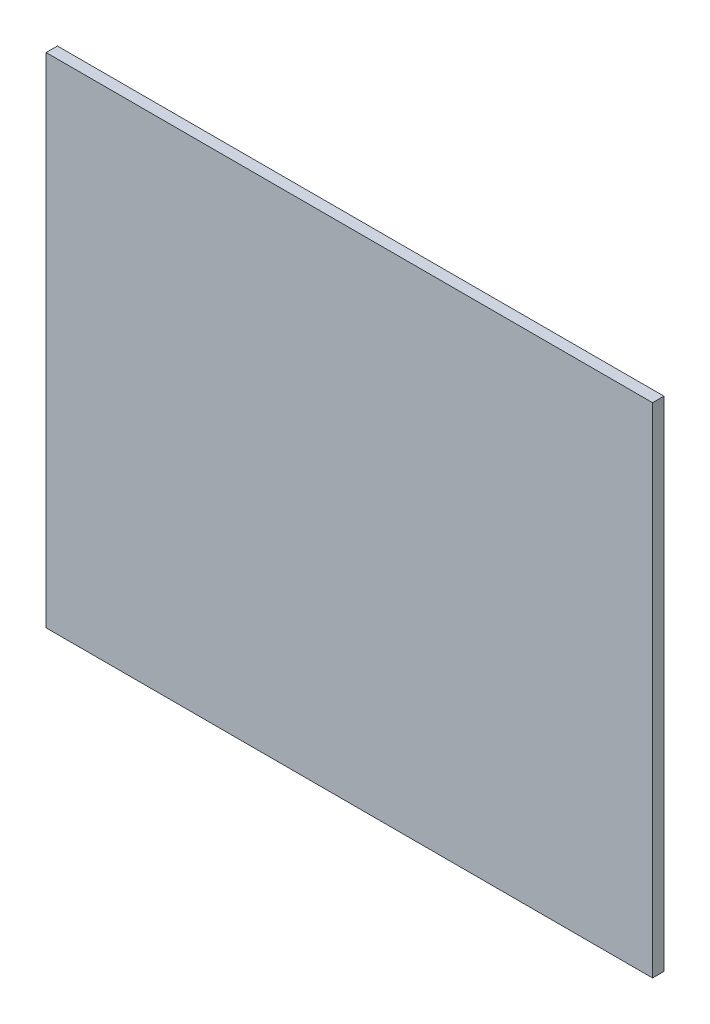
ISO-10303-21;
HEADER;
FILE_DESCRIPTION(('STEP AP214'),'2;1');
FILE_NAME('part.step','',(''),(''),'','','');
FILE_SCHEMA(('AUTOMOTIVE_DESIGN { 1 0 10303 214 1 1 1 1 }'));
ENDSEC;
DATA;
#1=APPLICATION_CONTEXT('core data for automotive mechanical design processes');
#2=APPLICATION_PROTOCOL_DEFINITION('international standard','automotive_design',2000,#1);
#3=PRODUCT_CONTEXT('',#1,'mechanical');
#4=PRODUCT('Part','Part','',(#3));
#5=PRODUCT_RELATED_PRODUCT_CATEGORY('part','',(#4));
#6=PRODUCT_DEFINITION_FORMATION('','',#4);
#7=PRODUCT_DEFINITION_CONTEXT('part definition',#1,'design');
#8=PRODUCT_DEFINITION('design','',#6,#7);
#9=PRODUCT_DEFINITION_SHAPE('','',#8);
#10=(LENGTH_UNIT() NAMED_UNIT(*) SI_UNIT(.MILLI.,.METRE.));
#11=(NAMED_UNIT(*) PLANE_ANGLE_UNIT() SI_UNIT($,.RADIAN.));
#12=(NAMED_UNIT(*) SI_UNIT($,.STERADIAN.) SOLID_ANGLE_UNIT());
#13=UNCERTAINTY_MEASURE_WITH_UNIT(LENGTH_MEASURE(1.E-05),#10,'distance_accuracy_value','');
#14=(GEOMETRIC_REPRESENTATION_CONTEXT(3) GLOBAL_UNCERTAINTY_ASSIGNED_CONTEXT((#13)) GLOBAL_UNIT_ASSIGNED_CONTEXT((#10,
#11,#12)) REPRESENTATION_CONTEXT('',''));
#15=CARTESIAN_POINT('',(0.,0.,0.));
#16=DIRECTION('',(0.,0.,1.));
#17=DIRECTION('',(1.,0.,0.));
#18=AXIS2_PLACEMENT_3D('',#15,#16,#17);
#19=CARTESIAN_POINT('',(0.,0.,18.));
#20=DIRECTION('',(1.,0.,0.));
#21=DIRECTION('',(0.,0.,-1.));
#22=AXIS2_PLACEMENT_3D('',#19,#20,#21);
#23=PLANE('',#22);
#24=DIRECTION('',(0.,-1.,0.));
#25=VECTOR('',#24,1.);
#26=CARTESIAN_POINT('',(0.,0.,0.));
#27=LINE('',#26,#25);
#28=CARTESIAN_POINT('',(0.,792.,0.));
#29=VERTEX_POINT('',#28);
#30=CARTESIAN_POINT('',(0.,0.,0.));
#31=VERTEX_POINT('',#30);
#32=EDGE_CURVE('E97',#29,#31,#27,.T.);
#33=ORIENTED_EDGE('',*,*,#32,.T.);
#34=DIRECTION('',(0.,0.,-1.));
#35=VECTOR('',#34,1.);
#36=CARTESIAN_POINT('',(0.,0.,18.));
#37=LINE('',#36,#35);
#38=CARTESIAN_POINT('',(0.,0.,18.));
#39=VERTEX_POINT('',#38);
#40=EDGE_CURVE('E11',#39,#31,#37,.T.);
#41=ORIENTED_EDGE('',*,*,#40,.F.);
#42=DIRECTION('',(0.,-1.,0.));
#43=VECTOR('',#42,1.);
#44=CARTESIAN_POINT('',(0.,0.,18.));
#45=LINE('',#44,#43);
#46=CARTESIAN_POINT('',(0.,792.,18.));
#47=VERTEX_POINT('',#46);
#48=EDGE_CURVE('E85',#47,#39,#45,.T.);
#49=ORIENTED_EDGE('',*,*,#48,.F.);
#50=DIRECTION('',(0.,0.,-1.));
#51=VECTOR('',#50,1.);
#52=CARTESIAN_POINT('',(0.,792.,18.));
#53=LINE('',#52,#51);
#54=EDGE_CURVE('E93',#47,#29,#53,.T.);
#55=ORIENTED_EDGE('',*,*,#54,.T.);
#56=EDGE_LOOP('',(#33,#41,#49,#55));
#57=FACE_BOUND('',#56,.T.);
#58=ADVANCED_FACE('F34',(#57),#23,.F.);
#59=CARTESIAN_POINT('',(0.,0.,18.));
#60=DIRECTION('',(0.,1.,0.));
#61=DIRECTION('',(0.,0.,1.));
#62=AXIS2_PLACEMENT_3D('',#59,#60,#61);
#63=PLANE('',#62);
#64=DIRECTION('',(1.,0.,0.));
#65=VECTOR('',#64,1.);
#66=CARTESIAN_POINT('',(0.,0.,0.));
#67=LINE('',#66,#65);
#68=CARTESIAN_POINT('',(964.,0.,0.));
#69=VERTEX_POINT('',#68);
#70=EDGE_CURVE('E89',#31,#69,#67,.T.);
#71=ORIENTED_EDGE('',*,*,#70,.T.);
#72=DIRECTION('',(0.,0.,-1.));
#73=VECTOR('',#72,1.);
#74=CARTESIAN_POINT('',(964.,0.,18.));
#75=LINE('',#74,#73);
#76=CARTESIAN_POINT('',(964.,0.,18.));
#77=VERTEX_POINT('',#76);
#78=EDGE_CURVE('E42',#77,#69,#75,.T.);
#79=ORIENTED_EDGE('',*,*,#78,.F.);
#80=DIRECTION('',(1.,0.,0.));
#81=VECTOR('',#80,1.);
#82=CARTESIAN_POINT('',(0.,0.,18.));
#83=LINE('',#82,#81);
#84=EDGE_CURVE('E80',#39,#77,#83,.T.);
#85=ORIENTED_EDGE('',*,*,#84,.F.);
#86=ORIENTED_EDGE('',*,*,#40,.T.);
#87=EDGE_LOOP('',(#71,#79,#85,#86));
#88=FACE_BOUND('',#87,.T.);
#89=ADVANCED_FACE('F88',(#88),#63,.F.);
#90=CARTESIAN_POINT('',(964.,0.,18.));
#91=DIRECTION('',(-1.,0.,0.));
#92=DIRECTION('',(0.,-1.,0.));
#93=AXIS2_PLACEMENT_3D('',#90,#91,#92);
#94=PLANE('',#93);
#95=DIRECTION('',(0.,1.,0.));
#96=VECTOR('',#95,1.);
#97=CARTESIAN_POINT('',(964.,0.,0.));
#98=LINE('',#97,#96);
#99=CARTESIAN_POINT('',(964.,792.,0.));
#100=VERTEX_POINT('',#99);
#101=EDGE_CURVE('E67',#69,#100,#98,.T.);
#102=ORIENTED_EDGE('',*,*,#101,.T.);
#103=DIRECTION('',(0.,0.,-1.));
#104=VECTOR('',#103,1.);
#105=CARTESIAN_POINT('',(964.,792.,18.));
#106=LINE('',#105,#104);
#107=CARTESIAN_POINT('',(964.,792.,18.));
#108=VERTEX_POINT('',#107);
#109=EDGE_CURVE('E90',#108,#100,#106,.T.);
#110=ORIENTED_EDGE('',*,*,#109,.F.);
#111=DIRECTION('',(0.,1.,0.));
#112=VECTOR('',#111,1.);
#113=CARTESIAN_POINT('',(964.,0.,18.));
#114=LINE('',#113,#112);
#115=EDGE_CURVE('E83',#77,#108,#114,.T.);
#116=ORIENTED_EDGE('',*,*,#115,.F.);
#117=ORIENTED_EDGE('',*,*,#78,.T.);
#118=EDGE_LOOP('',(#102,#110,#116,#117));
#119=FACE_BOUND('',#118,.T.);
#120=ADVANCED_FACE('F91',(#119),#94,.F.);
#121=CARTESIAN_POINT('',(0.,792.,18.));
#122=DIRECTION('',(0.,-1.,0.));
#123=DIRECTION('',(0.,0.,-1.));
#124=AXIS2_PLACEMENT_3D('',#121,#122,#123);
#125=PLANE('',#124);
#126=DIRECTION('',(-1.,0.,0.));
#127=VECTOR('',#126,1.);
#128=CARTESIAN_POINT('',(0.,792.,0.));
#129=LINE('',#128,#127);
#130=EDGE_CURVE('E73',#100,#29,#129,.T.);
#131=ORIENTED_EDGE('',*,*,#130,.T.);
#132=ORIENTED_EDGE('',*,*,#54,.F.);
#133=DIRECTION('',(-1.,0.,0.));
#134=VECTOR('',#133,1.);
#135=CARTESIAN_POINT('',(0.,792.,18.));
#136=LINE('',#135,#134);
#137=EDGE_CURVE('E50',#108,#47,#136,.T.);
#138=ORIENTED_EDGE('',*,*,#137,.F.);
#139=ORIENTED_EDGE('',*,*,#109,.T.);
#140=EDGE_LOOP('',(#131,#132,#138,#139));
#141=FACE_BOUND('',#140,.T.);
#142=ADVANCED_FACE('F104',(#141),#125,.F.);
#143=CARTESIAN_POINT('',(0.,0.,18.));
#144=DIRECTION('',(0.,0.,-1.));
#145=DIRECTION('',(-1.,0.,0.));
#146=AXIS2_PLACEMENT_3D('',#143,#144,#145);
#147=PLANE('',#146);
#148=ORIENTED_EDGE('',*,*,#48,.T.);
#149=ORIENTED_EDGE('',*,*,#84,.T.);
#150=ORIENTED_EDGE('',*,*,#115,.T.);
#151=ORIENTED_EDGE('',*,*,#137,.T.);
#152=EDGE_LOOP('',(#148,#149,#150,#151));
#153=FACE_BOUND('',#152,.T.);
#154=ADVANCED_FACE('F81',(#153),#147,.F.);
#155=CARTESIAN_POINT('',(0.,0.,0.));
#156=DIRECTION('',(0.,0.,-1.));
#157=DIRECTION('',(-1.,0.,0.));
#158=AXIS2_PLACEMENT_3D('',#155,#156,#157);
#159=PLANE('',#158);
#160=ORIENTED_EDGE('',*,*,#32,.F.);
#161=ORIENTED_EDGE('',*,*,#130,.F.);
#162=ORIENTED_EDGE('',*,*,#101,.F.);
#163=ORIENTED_EDGE('',*,*,#70,.F.);
#164=EDGE_LOOP('',(#160,#161,#162,#163));
#165=FACE_BOUND('',#164,.T.);
#166=ADVANCED_FACE('F107',(#165),#159,.T.);
#167=CLOSED_SHELL('',(#58,#89,#120,#142,#154,#166));
#168=MANIFOLD_SOLID_BREP('B2',#167);
#169=ADVANCED_BREP_SHAPE_REPRESENTATION('',(#18,#168),#14);
#170=SHAPE_DEFINITION_REPRESENTATION(#9,#169);
ENDSEC;
END-ISO-10303-21;
